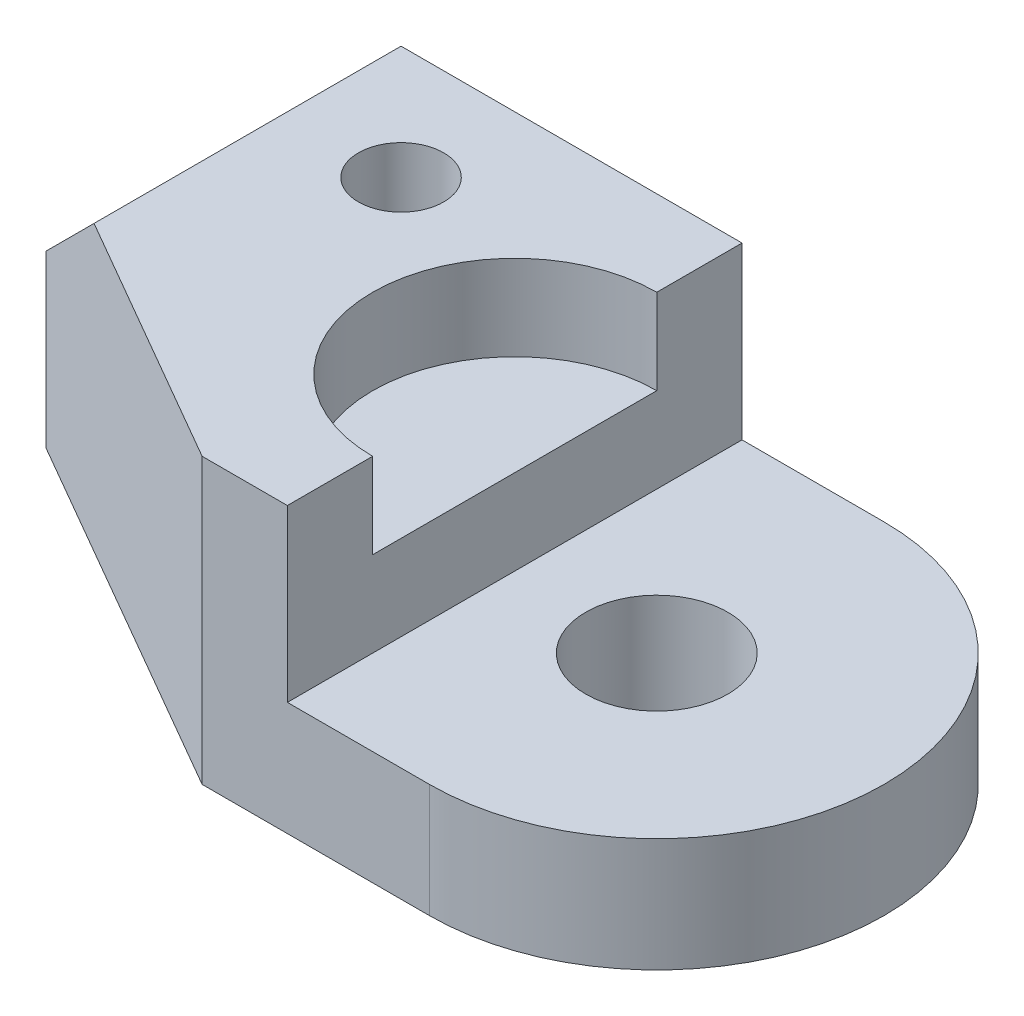
ISO-10303-21;
HEADER;
FILE_DESCRIPTION(('STEP AP214'),'2;1');
FILE_NAME('part.step','',(''),(''),'','','');
FILE_SCHEMA(('AUTOMOTIVE_DESIGN { 1 0 10303 214 1 1 1 1 }'));
ENDSEC;
DATA;
#1=APPLICATION_CONTEXT('core data for automotive mechanical design processes');
#2=APPLICATION_PROTOCOL_DEFINITION('international standard','automotive_design',2000,#1);
#3=PRODUCT_CONTEXT('',#1,'mechanical');
#4=PRODUCT('Part','Part','',(#3));
#5=PRODUCT_RELATED_PRODUCT_CATEGORY('part','',(#4));
#6=PRODUCT_DEFINITION_FORMATION('','',#4);
#7=PRODUCT_DEFINITION_CONTEXT('part definition',#1,'design');
#8=PRODUCT_DEFINITION('design','',#6,#7);
#9=PRODUCT_DEFINITION_SHAPE('','',#8);
#10=(LENGTH_UNIT() NAMED_UNIT(*) SI_UNIT(.MILLI.,.METRE.));
#11=(NAMED_UNIT(*) PLANE_ANGLE_UNIT() SI_UNIT($,.RADIAN.));
#12=(NAMED_UNIT(*) SI_UNIT($,.STERADIAN.) SOLID_ANGLE_UNIT());
#13=UNCERTAINTY_MEASURE_WITH_UNIT(LENGTH_MEASURE(1.E-05),#10,'distance_accuracy_value','');
#14=(GEOMETRIC_REPRESENTATION_CONTEXT(3) GLOBAL_UNCERTAINTY_ASSIGNED_CONTEXT((#13)) GLOBAL_UNIT_ASSIGNED_CONTEXT((#10,
#11,#12)) REPRESENTATION_CONTEXT('',''));
#15=CARTESIAN_POINT('',(0.,0.,0.));
#16=DIRECTION('',(0.,0.,1.));
#17=DIRECTION('',(1.,0.,0.));
#18=AXIS2_PLACEMENT_3D('',#15,#16,#17);
#19=CARTESIAN_POINT('',(0.,63.5,0.));
#20=DIRECTION('',(0.,-1.,0.));
#21=DIRECTION('',(0.,0.,-1.));
#22=AXIS2_PLACEMENT_3D('',#19,#20,#21);
#23=CYLINDRICAL_SURFACE('',#22,50.8);
#24=CARTESIAN_POINT('',(0.,25.4,0.));
#25=DIRECTION('',(0.,1.,0.));
#26=DIRECTION('',(0.,0.,1.));
#27=AXIS2_PLACEMENT_3D('',#24,#25,#26);
#28=CIRCLE('',#27,50.8);
#29=CARTESIAN_POINT('',(0.,25.4,50.8));
#30=VERTEX_POINT('',#29);
#31=CARTESIAN_POINT('',(0.,25.4,-50.8));
#32=VERTEX_POINT('',#31);
#33=EDGE_CURVE('E154',#30,#32,#28,.T.);
#34=ORIENTED_EDGE('',*,*,#33,.F.);
#35=DIRECTION('',(0.,-1.,0.));
#36=VECTOR('',#35,1.);
#37=CARTESIAN_POINT('',(0.,63.5,50.8));
#38=LINE('',#37,#36);
#39=CARTESIAN_POINT('',(0.,0.,50.8));
#40=VERTEX_POINT('',#39);
#41=EDGE_CURVE('E167',#30,#40,#38,.T.);
#42=ORIENTED_EDGE('',*,*,#41,.T.);
#43=CARTESIAN_POINT('',(0.,0.,0.));
#44=DIRECTION('',(0.,1.,0.));
#45=DIRECTION('',(0.,0.,1.));
#46=AXIS2_PLACEMENT_3D('',#43,#44,#45);
#47=CIRCLE('',#46,50.8);
#48=CARTESIAN_POINT('',(0.,0.,-50.8));
#49=VERTEX_POINT('',#48);
#50=EDGE_CURVE('E148',#40,#49,#47,.T.);
#51=ORIENTED_EDGE('',*,*,#50,.T.);
#52=DIRECTION('',(0.,-1.,0.));
#53=VECTOR('',#52,1.);
#54=CARTESIAN_POINT('',(0.,63.5,-50.8));
#55=LINE('',#54,#53);
#56=EDGE_CURVE('E181',#32,#49,#55,.T.);
#57=ORIENTED_EDGE('',*,*,#56,.F.);
#58=EDGE_LOOP('',(#34,#42,#51,#57));
#59=FACE_BOUND('',#58,.T.);
#60=ADVANCED_FACE('F49',(#59),#23,.T.);
#61=CARTESIAN_POINT('',(-133.35,63.5,-50.8));
#62=DIRECTION('',(0.,0.,1.));
#63=DIRECTION('',(1.,0.,0.));
#64=AXIS2_PLACEMENT_3D('',#61,#62,#63);
#65=PLANE('',#64);
#66=DIRECTION('',(0.,-1.,0.));
#67=VECTOR('',#66,1.);
#68=CARTESIAN_POINT('',(-133.35,63.5,-50.8));
#69=LINE('',#68,#67);
#70=CARTESIAN_POINT('',(-133.35,38.1000000000003,-50.8));
#71=VERTEX_POINT('',#70);
#72=CARTESIAN_POINT('',(-133.35,0.,-50.8));
#73=VERTEX_POINT('',#72);
#74=EDGE_CURVE('E179',#71,#73,#69,.T.);
#75=ORIENTED_EDGE('',*,*,#74,.F.);
#76=DIRECTION('',(-0.707106781186552,-0.707106781186544,0.));
#77=VECTOR('',#76,1.);
#78=CARTESIAN_POINT('',(-107.95,63.5,-50.8));
#79=LINE('',#78,#77);
#80=CARTESIAN_POINT('',(-107.95,63.5,-50.8));
#81=VERTEX_POINT('',#80);
#82=EDGE_CURVE('E225',#81,#71,#79,.T.);
#83=ORIENTED_EDGE('',*,*,#82,.F.);
#84=DIRECTION('',(-1.,0.,0.));
#85=VECTOR('',#84,1.);
#86=CARTESIAN_POINT('',(-133.35,63.5,-50.8));
#87=LINE('',#86,#85);
#88=CARTESIAN_POINT('',(-31.75,63.5,-50.8));
#89=VERTEX_POINT('',#88);
#90=EDGE_CURVE('E162',#89,#81,#87,.T.);
#91=ORIENTED_EDGE('',*,*,#90,.F.);
#92=DIRECTION('',(0.,-1.,0.));
#93=VECTOR('',#92,1.);
#94=CARTESIAN_POINT('',(-31.75,417.494146785598,-50.8));
#95=LINE('',#94,#93);
#96=CARTESIAN_POINT('',(-31.75,25.4,-50.8));
#97=VERTEX_POINT('',#96);
#98=EDGE_CURVE('E146',#89,#97,#95,.T.);
#99=ORIENTED_EDGE('',*,*,#98,.T.);
#100=DIRECTION('',(-1.,0.,0.));
#101=VECTOR('',#100,1.);
#102=CARTESIAN_POINT('',(-133.35,25.4,-50.8));
#103=LINE('',#102,#101);
#104=EDGE_CURVE('E156',#32,#97,#103,.T.);
#105=ORIENTED_EDGE('',*,*,#104,.F.);
#106=ORIENTED_EDGE('',*,*,#56,.T.);
#107=DIRECTION('',(-1.,0.,0.));
#108=VECTOR('',#107,1.);
#109=CARTESIAN_POINT('',(-133.35,0.,-50.8));
#110=LINE('',#109,#108);
#111=EDGE_CURVE('E170',#49,#73,#110,.T.);
#112=ORIENTED_EDGE('',*,*,#111,.T.);
#113=EDGE_LOOP('',(#75,#83,#91,#99,#105,#106,#112));
#114=FACE_BOUND('',#113,.T.);
#115=ADVANCED_FACE('F217',(#114),#65,.F.);
#116=CARTESIAN_POINT('',(0.,63.5,50.8));
#117=DIRECTION('',(0.,0.,-1.));
#118=DIRECTION('',(-1.,0.,0.));
#119=AXIS2_PLACEMENT_3D('',#116,#117,#118);
#120=PLANE('',#119);
#121=DIRECTION('',(1.,0.,0.));
#122=VECTOR('',#121,1.);
#123=CARTESIAN_POINT('',(0.,63.5,50.8));
#124=LINE('',#123,#122);
#125=CARTESIAN_POINT('',(-50.8,63.5,50.8));
#126=VERTEX_POINT('',#125);
#127=CARTESIAN_POINT('',(-31.75,63.5,50.8));
#128=VERTEX_POINT('',#127);
#129=EDGE_CURVE('E143',#126,#128,#124,.T.);
#130=ORIENTED_EDGE('',*,*,#129,.F.);
#131=DIRECTION('',(0.,1.,0.));
#132=VECTOR('',#131,1.);
#133=CARTESIAN_POINT('',(-50.8,0.,50.8));
#134=LINE('',#133,#132);
#135=CARTESIAN_POINT('',(-50.8,0.,50.8));
#136=VERTEX_POINT('',#135);
#137=EDGE_CURVE('E196',#136,#126,#134,.T.);
#138=ORIENTED_EDGE('',*,*,#137,.F.);
#139=DIRECTION('',(1.,0.,0.));
#140=VECTOR('',#139,1.);
#141=CARTESIAN_POINT('',(0.,0.,50.8));
#142=LINE('',#141,#140);
#143=EDGE_CURVE('E165',#136,#40,#142,.T.);
#144=ORIENTED_EDGE('',*,*,#143,.T.);
#145=ORIENTED_EDGE('',*,*,#41,.F.);
#146=DIRECTION('',(1.,0.,0.));
#147=VECTOR('',#146,1.);
#148=CARTESIAN_POINT('',(0.,25.4,50.8));
#149=LINE('',#148,#147);
#150=CARTESIAN_POINT('',(-31.75,25.4,50.8));
#151=VERTEX_POINT('',#150);
#152=EDGE_CURVE('E159',#151,#30,#149,.T.);
#153=ORIENTED_EDGE('',*,*,#152,.F.);
#154=DIRECTION('',(0.,-1.,0.));
#155=VECTOR('',#154,1.);
#156=CARTESIAN_POINT('',(-31.75,417.494146785598,50.8));
#157=LINE('',#156,#155);
#158=EDGE_CURVE('E150',#128,#151,#157,.T.);
#159=ORIENTED_EDGE('',*,*,#158,.F.);
#160=EDGE_LOOP('',(#130,#138,#144,#145,#153,#159));
#161=FACE_BOUND('',#160,.T.);
#162=ADVANCED_FACE('F207',(#161),#120,.F.);
#163=CARTESIAN_POINT('',(0.,63.5,0.));
#164=DIRECTION('',(0.,1.,0.));
#165=DIRECTION('',(0.,0.,1.));
#166=AXIS2_PLACEMENT_3D('',#163,#164,#165);
#167=PLANE('',#166);
#168=CARTESIAN_POINT('',(-82.55,63.5,-25.4));
#169=DIRECTION('',(0.,1.,0.));
#170=DIRECTION('',(0.,0.,1.));
#171=AXIS2_PLACEMENT_3D('',#168,#169,#170);
#172=CIRCLE('',#171,9.52500000000001);
#173=CARTESIAN_POINT('',(-82.55,63.5,-15.875));
#174=VERTEX_POINT('',#173);
#175=EDGE_CURVE('E229',#174,#174,#172,.T.);
#176=ORIENTED_EDGE('',*,*,#175,.F.);
#177=EDGE_LOOP('',(#176));
#178=FACE_BOUND('',#177,.T.);
#179=CARTESIAN_POINT('',(-31.75,63.5,0.));
#180=DIRECTION('',(0.,1.,0.));
#181=DIRECTION('',(0.,0.,1.));
#182=AXIS2_PLACEMENT_3D('',#179,#180,#181);
#183=CIRCLE('',#182,31.75);
#184=CARTESIAN_POINT('',(-31.75,63.5,-31.75));
#185=VERTEX_POINT('',#184);
#186=CARTESIAN_POINT('',(-31.75,63.5,31.75));
#187=VERTEX_POINT('',#186);
#188=EDGE_CURVE('E123',#185,#187,#183,.T.);
#189=ORIENTED_EDGE('',*,*,#188,.F.);
#190=DIRECTION('',(0.,0.,1.));
#191=VECTOR('',#190,1.);
#192=CARTESIAN_POINT('',(-31.75,63.5,-50.8));
#193=LINE('',#192,#191);
#194=EDGE_CURVE('E145',#89,#185,#193,.T.);
#195=ORIENTED_EDGE('',*,*,#194,.F.);
#196=ORIENTED_EDGE('',*,*,#90,.T.);
#197=DIRECTION('',(0.,0.,-1.));
#198=VECTOR('',#197,1.);
#199=CARTESIAN_POINT('',(-107.95,63.5,50.8));
#200=LINE('',#199,#198);
#201=CARTESIAN_POINT('',(-107.95,63.5,17.8044321158125));
#202=VERTEX_POINT('',#201);
#203=EDGE_CURVE('E223',#202,#81,#200,.T.);
#204=ORIENTED_EDGE('',*,*,#203,.F.);
#205=DIRECTION('',(-0.866025403784436,0.,-0.500000000000004));
#206=VECTOR('',#205,1.);
#207=CARTESIAN_POINT('',(-34.6970452561251,63.5,60.0970452561247));
#208=LINE('',#207,#206);
#209=EDGE_CURVE('E190',#126,#202,#208,.T.);
#210=ORIENTED_EDGE('',*,*,#209,.F.);
#211=ORIENTED_EDGE('',*,*,#129,.T.);
#212=EDGE_CURVE('E137',#187,#128,#193,.T.);
#213=ORIENTED_EDGE('',*,*,#212,.F.);
#214=EDGE_LOOP('',(#189,#195,#196,#204,#210,#211,#213));
#215=FACE_BOUND('',#214,.T.);
#216=ADVANCED_FACE('F140',(#178,#215),#167,.T.);
#217=CARTESIAN_POINT('',(-133.35,63.5,50.8));
#218=DIRECTION('',(1.,0.,0.));
#219=DIRECTION('',(0.,0.,-1.));
#220=AXIS2_PLACEMENT_3D('',#217,#218,#219);
#221=PLANE('',#220);
#222=DIRECTION('',(0.,1.,0.));
#223=VECTOR('',#222,1.);
#224=CARTESIAN_POINT('',(-133.35,0.,3.13973527839589));
#225=LINE('',#224,#223);
#226=CARTESIAN_POINT('',(-133.35,0.,3.13973527839589));
#227=VERTEX_POINT('',#226);
#228=CARTESIAN_POINT('',(-133.35,38.1000000000002,3.13973527839588));
#229=VERTEX_POINT('',#228);
#230=EDGE_CURVE('E157',#227,#229,#225,.T.);
#231=ORIENTED_EDGE('',*,*,#230,.T.);
#232=DIRECTION('',(0.,0.,-1.));
#233=VECTOR('',#232,1.);
#234=CARTESIAN_POINT('',(-133.35,38.1000000000003,50.8));
#235=LINE('',#234,#233);
#236=EDGE_CURVE('E70',#229,#71,#235,.T.);
#237=ORIENTED_EDGE('',*,*,#236,.T.);
#238=ORIENTED_EDGE('',*,*,#74,.T.);
#239=DIRECTION('',(0.,0.,1.));
#240=VECTOR('',#239,1.);
#241=CARTESIAN_POINT('',(-133.35,0.,50.8));
#242=LINE('',#241,#240);
#243=EDGE_CURVE('E173',#73,#227,#242,.T.);
#244=ORIENTED_EDGE('',*,*,#243,.T.);
#245=EDGE_LOOP('',(#231,#237,#238,#244));
#246=FACE_BOUND('',#245,.T.);
#247=ADVANCED_FACE('F193',(#246),#221,.F.);
#248=CARTESIAN_POINT('',(0.,0.,0.));
#249=DIRECTION('',(0.,1.,0.));
#250=DIRECTION('',(0.,0.,1.));
#251=AXIS2_PLACEMENT_3D('',#248,#249,#250);
#252=PLANE('',#251);
#253=CARTESIAN_POINT('',(0.,0.,0.));
#254=DIRECTION('',(0.,1.,0.));
#255=DIRECTION('',(0.,0.,1.));
#256=AXIS2_PLACEMENT_3D('',#253,#254,#255);
#257=CIRCLE('',#256,15.875);
#258=CARTESIAN_POINT('',(0.,0.,15.875));
#259=VERTEX_POINT('',#258);
#260=EDGE_CURVE('E232',#259,#259,#257,.T.);
#261=ORIENTED_EDGE('',*,*,#260,.T.);
#262=EDGE_LOOP('',(#261));
#263=FACE_BOUND('',#262,.T.);
#264=CARTESIAN_POINT('',(-82.55,0.,-25.4));
#265=DIRECTION('',(0.,1.,0.));
#266=DIRECTION('',(0.,0.,1.));
#267=AXIS2_PLACEMENT_3D('',#264,#265,#266);
#268=CIRCLE('',#267,9.52500000000001);
#269=CARTESIAN_POINT('',(-82.55,0.,-15.875));
#270=VERTEX_POINT('',#269);
#271=EDGE_CURVE('E132',#270,#270,#268,.T.);
#272=ORIENTED_EDGE('',*,*,#271,.T.);
#273=EDGE_LOOP('',(#272));
#274=FACE_BOUND('',#273,.T.);
#275=ORIENTED_EDGE('',*,*,#143,.F.);
#276=DIRECTION('',(-0.866025403784436,0.,-0.500000000000004));
#277=VECTOR('',#276,1.);
#278=CARTESIAN_POINT('',(-34.6970452561251,0.,60.0970452561247));
#279=LINE('',#278,#277);
#280=EDGE_CURVE('E198',#136,#227,#279,.T.);
#281=ORIENTED_EDGE('',*,*,#280,.T.);
#282=ORIENTED_EDGE('',*,*,#243,.F.);
#283=ORIENTED_EDGE('',*,*,#111,.F.);
#284=ORIENTED_EDGE('',*,*,#50,.F.);
#285=EDGE_LOOP('',(#275,#281,#282,#283,#284));
#286=FACE_BOUND('',#285,.T.);
#287=ADVANCED_FACE('F220',(#263,#274,#286),#252,.F.);
#288=CARTESIAN_POINT('',(-31.75,417.494146785598,-50.8));
#289=DIRECTION('',(1.,0.,0.));
#290=DIRECTION('',(0.,0.,-1.));
#291=AXIS2_PLACEMENT_3D('',#288,#289,#290);
#292=PLANE('',#291);
#293=DIRECTION('',(0.,1.,0.));
#294=VECTOR('',#293,1.);
#295=CARTESIAN_POINT('',(-31.75,44.45,-31.75));
#296=LINE('',#295,#294);
#297=CARTESIAN_POINT('',(-31.75,44.45,-31.75));
#298=VERTEX_POINT('',#297);
#299=EDGE_CURVE('E13',#298,#185,#296,.T.);
#300=ORIENTED_EDGE('',*,*,#299,.F.);
#301=DIRECTION('',(0.,0.,1.));
#302=VECTOR('',#301,1.);
#303=CARTESIAN_POINT('',(-31.75,44.45,-50.8));
#304=LINE('',#303,#302);
#305=CARTESIAN_POINT('',(-31.75,44.45,31.75));
#306=VERTEX_POINT('',#305);
#307=EDGE_CURVE('E139',#298,#306,#304,.T.);
#308=ORIENTED_EDGE('',*,*,#307,.T.);
#309=DIRECTION('',(0.,1.,0.));
#310=VECTOR('',#309,1.);
#311=CARTESIAN_POINT('',(-31.75,44.45,31.75));
#312=LINE('',#311,#310);
#313=EDGE_CURVE('E56',#187,#306,#312,.F.);
#314=ORIENTED_EDGE('',*,*,#313,.F.);
#315=ORIENTED_EDGE('',*,*,#212,.T.);
#316=ORIENTED_EDGE('',*,*,#158,.T.);
#317=DIRECTION('',(0.,0.,1.));
#318=VECTOR('',#317,1.);
#319=CARTESIAN_POINT('',(-31.75,25.4,-50.8));
#320=LINE('',#319,#318);
#321=EDGE_CURVE('E161',#97,#151,#320,.T.);
#322=ORIENTED_EDGE('',*,*,#321,.F.);
#323=ORIENTED_EDGE('',*,*,#98,.F.);
#324=ORIENTED_EDGE('',*,*,#194,.T.);
#325=EDGE_LOOP('',(#300,#308,#314,#315,#316,#322,#323,#324));
#326=FACE_BOUND('',#325,.T.);
#327=ADVANCED_FACE('F135',(#326),#292,.T.);
#328=CARTESIAN_POINT('',(0.,25.4,0.));
#329=DIRECTION('',(0.,1.,0.));
#330=DIRECTION('',(0.,0.,1.));
#331=AXIS2_PLACEMENT_3D('',#328,#329,#330);
#332=PLANE('',#331);
#333=CARTESIAN_POINT('',(0.,25.4,0.));
#334=DIRECTION('',(0.,1.,0.));
#335=DIRECTION('',(0.,0.,1.));
#336=AXIS2_PLACEMENT_3D('',#333,#334,#335);
#337=CIRCLE('',#336,15.875);
#338=CARTESIAN_POINT('',(0.,25.4,15.875));
#339=VERTEX_POINT('',#338);
#340=EDGE_CURVE('E235',#339,#339,#337,.T.);
#341=ORIENTED_EDGE('',*,*,#340,.F.);
#342=EDGE_LOOP('',(#341));
#343=FACE_BOUND('',#342,.T.);
#344=ORIENTED_EDGE('',*,*,#321,.T.);
#345=ORIENTED_EDGE('',*,*,#152,.T.);
#346=ORIENTED_EDGE('',*,*,#33,.T.);
#347=ORIENTED_EDGE('',*,*,#104,.T.);
#348=EDGE_LOOP('',(#344,#345,#346,#347));
#349=FACE_BOUND('',#348,.T.);
#350=ADVANCED_FACE('F210',(#343,#349),#332,.T.);
#351=CARTESIAN_POINT('',(-34.6970452561251,0.,60.0970452561247));
#352=DIRECTION('',(0.500000000000004,0.,-0.866025403784436));
#353=DIRECTION('',(-0.866025403784436,0.,-0.500000000000004));
#354=AXIS2_PLACEMENT_3D('',#351,#352,#353);
#355=PLANE('',#354);
#356=ORIENTED_EDGE('',*,*,#209,.T.);
#357=DIRECTION('',(-0.654653670707979,-0.654653670707972,-0.377964473009232));
#358=VECTOR('',#357,1.);
#359=CARTESIAN_POINT('',(-93.3054544320708,78.144545567929,26.2594644416163));
#360=LINE('',#359,#358);
#361=EDGE_CURVE('E183',#202,#229,#360,.T.);
#362=ORIENTED_EDGE('',*,*,#361,.T.);
#363=ORIENTED_EDGE('',*,*,#230,.F.);
#364=ORIENTED_EDGE('',*,*,#280,.F.);
#365=ORIENTED_EDGE('',*,*,#137,.T.);
#366=EDGE_LOOP('',(#356,#362,#363,#364,#365));
#367=FACE_BOUND('',#366,.T.);
#368=ADVANCED_FACE('F188',(#367),#355,.F.);
#369=CARTESIAN_POINT('',(-107.95,63.5,50.8));
#370=DIRECTION('',(0.707106781186543,-0.707106781186551,0.));
#371=DIRECTION('',(0.707106781186551,0.707106781186544,0.));
#372=AXIS2_PLACEMENT_3D('',#369,#370,#371);
#373=PLANE('',#372);
#374=ORIENTED_EDGE('',*,*,#203,.T.);
#375=ORIENTED_EDGE('',*,*,#82,.T.);
#376=ORIENTED_EDGE('',*,*,#236,.F.);
#377=ORIENTED_EDGE('',*,*,#361,.F.);
#378=EDGE_LOOP('',(#374,#375,#376,#377));
#379=FACE_BOUND('',#378,.T.);
#380=ADVANCED_FACE('F256',(#379),#373,.F.);
#381=CARTESIAN_POINT('',(-31.75,44.45,0.));
#382=DIRECTION('',(0.,1.,0.));
#383=DIRECTION('',(0.,0.,1.));
#384=AXIS2_PLACEMENT_3D('',#381,#382,#383);
#385=CYLINDRICAL_SURFACE('',#384,31.75);
#386=ORIENTED_EDGE('',*,*,#299,.T.);
#387=ORIENTED_EDGE('',*,*,#188,.T.);
#388=ORIENTED_EDGE('',*,*,#313,.T.);
#389=CARTESIAN_POINT('',(-31.75,44.45,0.));
#390=DIRECTION('',(0.,1.,0.));
#391=DIRECTION('',(0.,0.,1.));
#392=AXIS2_PLACEMENT_3D('',#389,#390,#391);
#393=CIRCLE('',#392,31.75);
#394=EDGE_CURVE('E62',#298,#306,#393,.T.);
#395=ORIENTED_EDGE('',*,*,#394,.F.);
#396=EDGE_LOOP('',(#386,#387,#388,#395));
#397=FACE_BOUND('',#396,.T.);
#398=ADVANCED_FACE('F125',(#397),#385,.F.);
#399=CARTESIAN_POINT('',(-31.75,44.45,0.));
#400=DIRECTION('',(0.,1.,0.));
#401=DIRECTION('',(0.,0.,1.));
#402=AXIS2_PLACEMENT_3D('',#399,#400,#401);
#403=PLANE('',#402);
#404=ORIENTED_EDGE('',*,*,#394,.T.);
#405=ORIENTED_EDGE('',*,*,#307,.F.);
#406=EDGE_LOOP('',(#404,#405));
#407=FACE_BOUND('',#406,.T.);
#408=ADVANCED_FACE('F279',(#407),#403,.T.);
#409=CARTESIAN_POINT('',(-82.55,0.,-25.4));
#410=DIRECTION('',(0.,1.,0.));
#411=DIRECTION('',(0.,0.,1.));
#412=AXIS2_PLACEMENT_3D('',#409,#410,#411);
#413=CYLINDRICAL_SURFACE('',#412,9.52500000000001);
#414=ORIENTED_EDGE('',*,*,#271,.F.);
#415=EDGE_LOOP('',(#414));
#416=FACE_BOUND('',#415,.T.);
#417=ORIENTED_EDGE('',*,*,#175,.T.);
#418=EDGE_LOOP('',(#417));
#419=FACE_BOUND('',#418,.T.);
#420=ADVANCED_FACE('F246',(#416,#419),#413,.F.);
#421=CARTESIAN_POINT('',(0.,0.,0.));
#422=DIRECTION('',(0.,1.,0.));
#423=DIRECTION('',(0.,0.,1.));
#424=AXIS2_PLACEMENT_3D('',#421,#422,#423);
#425=CYLINDRICAL_SURFACE('',#424,15.875);
#426=ORIENTED_EDGE('',*,*,#260,.F.);
#427=EDGE_LOOP('',(#426));
#428=FACE_BOUND('',#427,.T.);
#429=ORIENTED_EDGE('',*,*,#340,.T.);
#430=EDGE_LOOP('',(#429));
#431=FACE_BOUND('',#430,.T.);
#432=ADVANCED_FACE('F243',(#428,#431),#425,.F.);
#433=CLOSED_SHELL('',(#60,#115,#162,#216,#247,#287,#327,#350,#368,#380,#398,#408,#420,#432));
#434=MANIFOLD_SOLID_BREP('B2',#433);
#435=ADVANCED_BREP_SHAPE_REPRESENTATION('',(#18,#434),#14);
#436=SHAPE_DEFINITION_REPRESENTATION(#9,#435);
ENDSEC;
END-ISO-10303-21;
